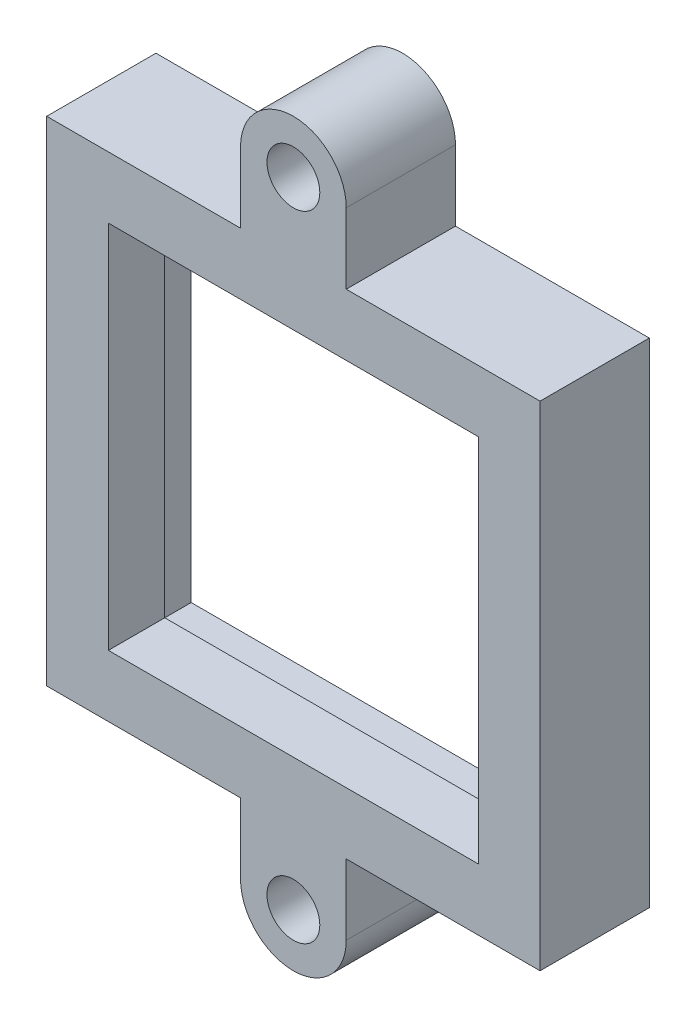
ISO-10303-21;
HEADER;
FILE_DESCRIPTION(('STEP AP214'),'2;1');
FILE_NAME('part.step','',(''),(''),'','','');
FILE_SCHEMA(('AUTOMOTIVE_DESIGN { 1 0 10303 214 1 1 1 1 }'));
ENDSEC;
DATA;
#1=APPLICATION_CONTEXT('core data for automotive mechanical design processes');
#2=APPLICATION_PROTOCOL_DEFINITION('international standard','automotive_design',2000,#1);
#3=PRODUCT_CONTEXT('',#1,'mechanical');
#4=PRODUCT('Part','Part','',(#3));
#5=PRODUCT_RELATED_PRODUCT_CATEGORY('part','',(#4));
#6=PRODUCT_DEFINITION_FORMATION('','',#4);
#7=PRODUCT_DEFINITION_CONTEXT('part definition',#1,'design');
#8=PRODUCT_DEFINITION('design','',#6,#7);
#9=PRODUCT_DEFINITION_SHAPE('','',#8);
#10=(LENGTH_UNIT() NAMED_UNIT(*) SI_UNIT(.MILLI.,.METRE.));
#11=(NAMED_UNIT(*) PLANE_ANGLE_UNIT() SI_UNIT($,.RADIAN.));
#12=(NAMED_UNIT(*) SI_UNIT($,.STERADIAN.) SOLID_ANGLE_UNIT());
#13=UNCERTAINTY_MEASURE_WITH_UNIT(LENGTH_MEASURE(1.E-05),#10,'distance_accuracy_value','');
#14=(GEOMETRIC_REPRESENTATION_CONTEXT(3) GLOBAL_UNCERTAINTY_ASSIGNED_CONTEXT((#13)) GLOBAL_UNIT_ASSIGNED_CONTEXT((#10,
#11,#12)) REPRESENTATION_CONTEXT('',''));
#15=CARTESIAN_POINT('',(0.,0.,0.));
#16=DIRECTION('',(0.,0.,1.));
#17=DIRECTION('',(1.,0.,0.));
#18=AXIS2_PLACEMENT_3D('',#15,#16,#17);
#19=CARTESIAN_POINT('',(-1.5,10.5,0.));
#20=DIRECTION('',(-1.,0.,0.));
#21=DIRECTION('',(0.,0.,1.));
#22=AXIS2_PLACEMENT_3D('',#19,#20,#21);
#23=PLANE('',#22);
#24=DIRECTION('',(0.,0.,-1.));
#25=VECTOR('',#24,1.);
#26=CARTESIAN_POINT('',(-1.5,7.,0.));
#27=LINE('',#26,#25);
#28=CARTESIAN_POINT('',(-1.5,7.,3.1));
#29=VERTEX_POINT('',#28);
#30=CARTESIAN_POINT('',(-1.5,7.,0.));
#31=VERTEX_POINT('',#30);
#32=EDGE_CURVE('E298',#29,#31,#27,.T.);
#33=ORIENTED_EDGE('',*,*,#32,.F.);
#34=DIRECTION('',(0.,-1.,0.));
#35=VECTOR('',#34,1.);
#36=CARTESIAN_POINT('',(-1.5,9.,3.1));
#37=LINE('',#36,#35);
#38=CARTESIAN_POINT('',(-1.5,9.,3.1));
#39=VERTEX_POINT('',#38);
#40=EDGE_CURVE('E276',#39,#29,#37,.T.);
#41=ORIENTED_EDGE('',*,*,#40,.F.);
#42=DIRECTION('',(0.,0.,1.));
#43=VECTOR('',#42,1.);
#44=CARTESIAN_POINT('',(-1.5,9.,-2.));
#45=LINE('',#44,#43);
#46=CARTESIAN_POINT('',(-1.5,9.,0.));
#47=VERTEX_POINT('',#46);
#48=EDGE_CURVE('E291',#47,#39,#45,.T.);
#49=ORIENTED_EDGE('',*,*,#48,.F.);
#50=DIRECTION('',(0.,-1.,0.));
#51=VECTOR('',#50,1.);
#52=CARTESIAN_POINT('',(-1.5,10.5,0.));
#53=LINE('',#52,#51);
#54=EDGE_CURVE('E86',#47,#31,#53,.T.);
#55=ORIENTED_EDGE('',*,*,#54,.T.);
#56=EDGE_LOOP('',(#33,#41,#49,#55));
#57=FACE_BOUND('',#56,.T.);
#58=ADVANCED_FACE('F71',(#57),#23,.T.);
#59=CARTESIAN_POINT('',(-7.,7.,1.5));
#60=DIRECTION('',(0.,-1.,0.));
#61=DIRECTION('',(1.,0.,0.));
#62=AXIS2_PLACEMENT_3D('',#59,#60,#61);
#63=PLANE('',#62);
#64=DIRECTION('',(-1.,0.,0.));
#65=VECTOR('',#64,1.);
#66=CARTESIAN_POINT('',(-7.,7.,0.));
#67=LINE('',#66,#65);
#68=CARTESIAN_POINT('',(7.,7.,0.));
#69=VERTEX_POINT('',#68);
#70=CARTESIAN_POINT('',(1.5,7.,0.));
#71=VERTEX_POINT('',#70);
#72=EDGE_CURVE('E361',#69,#71,#67,.T.);
#73=ORIENTED_EDGE('',*,*,#72,.T.);
#74=DIRECTION('',(0.,0.,1.));
#75=VECTOR('',#74,1.);
#76=CARTESIAN_POINT('',(1.5,7.,0.));
#77=LINE('',#76,#75);
#78=CARTESIAN_POINT('',(1.5,7.,3.1));
#79=VERTEX_POINT('',#78);
#80=EDGE_CURVE('E296',#71,#79,#77,.T.);
#81=ORIENTED_EDGE('',*,*,#80,.T.);
#82=DIRECTION('',(-1.,0.,0.));
#83=VECTOR('',#82,1.);
#84=CARTESIAN_POINT('',(7.,7.,3.1));
#85=LINE('',#84,#83);
#86=CARTESIAN_POINT('',(7.,7.,3.1));
#87=VERTEX_POINT('',#86);
#88=EDGE_CURVE('E267',#87,#79,#85,.T.);
#89=ORIENTED_EDGE('',*,*,#88,.F.);
#90=DIRECTION('',(0.,0.,-1.));
#91=VECTOR('',#90,1.);
#92=CARTESIAN_POINT('',(7.,7.,1.5));
#93=LINE('',#92,#91);
#94=EDGE_CURVE('E367',#87,#69,#93,.T.);
#95=ORIENTED_EDGE('',*,*,#94,.T.);
#96=EDGE_LOOP('',(#73,#81,#89,#95));
#97=FACE_BOUND('',#96,.T.);
#98=ADVANCED_FACE('F413',(#97),#63,.F.);
#99=CARTESIAN_POINT('',(0.,0.,0.));
#100=DIRECTION('',(0.,0.,-1.));
#101=DIRECTION('',(-1.,0.,0.));
#102=AXIS2_PLACEMENT_3D('',#99,#100,#101);
#103=PLANE('',#102);
#104=CARTESIAN_POINT('',(0.,9.,0.));
#105=DIRECTION('',(0.,0.,-1.));
#106=DIRECTION('',(-1.,0.,0.));
#107=AXIS2_PLACEMENT_3D('',#104,#105,#106);
#108=CIRCLE('',#107,1.5);
#109=CARTESIAN_POINT('',(1.5,9.,0.));
#110=VERTEX_POINT('',#109);
#111=EDGE_CURVE('E293',#110,#47,#108,.F.);
#112=ORIENTED_EDGE('',*,*,#111,.F.);
#113=DIRECTION('',(0.,-1.,0.));
#114=VECTOR('',#113,1.);
#115=CARTESIAN_POINT('',(1.5,10.5,0.));
#116=LINE('',#115,#114);
#117=EDGE_CURVE('E301',#110,#71,#116,.T.);
#118=ORIENTED_EDGE('',*,*,#117,.T.);
#119=ORIENTED_EDGE('',*,*,#72,.F.);
#120=DIRECTION('',(0.,1.,0.));
#121=VECTOR('',#120,1.);
#122=CARTESIAN_POINT('',(7.,-7.,0.));
#123=LINE('',#122,#121);
#124=CARTESIAN_POINT('',(7.,-7.,0.));
#125=VERTEX_POINT('',#124);
#126=EDGE_CURVE('E358',#125,#69,#123,.T.);
#127=ORIENTED_EDGE('',*,*,#126,.F.);
#128=DIRECTION('',(1.,0.,0.));
#129=VECTOR('',#128,1.);
#130=CARTESIAN_POINT('',(-7.,-7.,0.));
#131=LINE('',#130,#129);
#132=CARTESIAN_POINT('',(1.5,-7.,0.));
#133=VERTEX_POINT('',#132);
#134=EDGE_CURVE('E354',#133,#125,#131,.T.);
#135=ORIENTED_EDGE('',*,*,#134,.F.);
#136=DIRECTION('',(0.,1.,0.));
#137=VECTOR('',#136,1.);
#138=CARTESIAN_POINT('',(1.5,-10.5,0.));
#139=LINE('',#138,#137);
#140=CARTESIAN_POINT('',(1.5,-9.,0.));
#141=VERTEX_POINT('',#140);
#142=EDGE_CURVE('E94',#141,#133,#139,.T.);
#143=ORIENTED_EDGE('',*,*,#142,.F.);
#144=CARTESIAN_POINT('',(0.,-9.,0.));
#145=DIRECTION('',(0.,0.,-1.));
#146=DIRECTION('',(-1.,0.,0.));
#147=AXIS2_PLACEMENT_3D('',#144,#145,#146);
#148=CIRCLE('',#147,1.5);
#149=CARTESIAN_POINT('',(-1.5,-9.,0.));
#150=VERTEX_POINT('',#149);
#151=EDGE_CURVE('E305',#141,#150,#148,.T.);
#152=ORIENTED_EDGE('',*,*,#151,.T.);
#153=DIRECTION('',(0.,1.,0.));
#154=VECTOR('',#153,1.);
#155=CARTESIAN_POINT('',(-1.5,-10.5,0.));
#156=LINE('',#155,#154);
#157=CARTESIAN_POINT('',(-1.5,-7.,0.));
#158=VERTEX_POINT('',#157);
#159=EDGE_CURVE('E315',#150,#158,#156,.T.);
#160=ORIENTED_EDGE('',*,*,#159,.T.);
#161=CARTESIAN_POINT('',(-7.,-7.,0.));
#162=VERTEX_POINT('',#161);
#163=EDGE_CURVE('E355',#162,#158,#131,.T.);
#164=ORIENTED_EDGE('',*,*,#163,.F.);
#165=DIRECTION('',(0.,-1.,0.));
#166=VECTOR('',#165,1.);
#167=CARTESIAN_POINT('',(-7.,-7.,0.));
#168=LINE('',#167,#166);
#169=CARTESIAN_POINT('',(-7.,7.,0.));
#170=VERTEX_POINT('',#169);
#171=EDGE_CURVE('E351',#170,#162,#168,.T.);
#172=ORIENTED_EDGE('',*,*,#171,.F.);
#173=EDGE_CURVE('E360',#31,#170,#67,.T.);
#174=ORIENTED_EDGE('',*,*,#173,.F.);
#175=ORIENTED_EDGE('',*,*,#54,.F.);
#176=EDGE_LOOP('',(#112,#118,#119,#127,#135,#143,#152,#160,#164,#172,#174,#175));
#177=FACE_BOUND('',#176,.T.);
#178=CARTESIAN_POINT('',(0.,9.,0.));
#179=DIRECTION('',(0.,0.,-1.));
#180=DIRECTION('',(-1.,0.,0.));
#181=AXIS2_PLACEMENT_3D('',#178,#179,#180);
#182=CIRCLE('',#181,0.750000000000001);
#183=CARTESIAN_POINT('',(-0.75,9.,0.));
#184=VERTEX_POINT('',#183);
#185=EDGE_CURVE('E295',#184,#184,#182,.F.);
#186=ORIENTED_EDGE('',*,*,#185,.T.);
#187=EDGE_LOOP('',(#186));
#188=FACE_BOUND('',#187,.T.);
#189=CARTESIAN_POINT('',(0.,-9.,0.));
#190=DIRECTION('',(0.,0.,-1.));
#191=DIRECTION('',(-1.,0.,0.));
#192=AXIS2_PLACEMENT_3D('',#189,#190,#191);
#193=CIRCLE('',#192,0.750000000000001);
#194=CARTESIAN_POINT('',(-0.75,-9.,0.));
#195=VERTEX_POINT('',#194);
#196=EDGE_CURVE('E308',#195,#195,#193,.T.);
#197=ORIENTED_EDGE('',*,*,#196,.F.);
#198=EDGE_LOOP('',(#197));
#199=FACE_BOUND('',#198,.T.);
#200=DIRECTION('',(1.,0.,0.));
#201=VECTOR('',#200,1.);
#202=CARTESIAN_POINT('',(-6.,-6.,0.));
#203=LINE('',#202,#201);
#204=CARTESIAN_POINT('',(-6.,-6.,0.));
#205=VERTEX_POINT('',#204);
#206=CARTESIAN_POINT('',(6.,-6.,0.));
#207=VERTEX_POINT('',#206);
#208=EDGE_CURVE('E322',#205,#207,#203,.T.);
#209=ORIENTED_EDGE('',*,*,#208,.T.);
#210=DIRECTION('',(0.,1.,0.));
#211=VECTOR('',#210,1.);
#212=CARTESIAN_POINT('',(6.,-6.,0.));
#213=LINE('',#212,#211);
#214=CARTESIAN_POINT('',(6.,6.,0.));
#215=VERTEX_POINT('',#214);
#216=EDGE_CURVE('E317',#207,#215,#213,.T.);
#217=ORIENTED_EDGE('',*,*,#216,.T.);
#218=DIRECTION('',(-1.,0.,0.));
#219=VECTOR('',#218,1.);
#220=CARTESIAN_POINT('',(-6.,6.,0.));
#221=LINE('',#220,#219);
#222=CARTESIAN_POINT('',(-6.,6.,0.));
#223=VERTEX_POINT('',#222);
#224=EDGE_CURVE('E334',#215,#223,#221,.T.);
#225=ORIENTED_EDGE('',*,*,#224,.T.);
#226=DIRECTION('',(0.,-1.,0.));
#227=VECTOR('',#226,1.);
#228=CARTESIAN_POINT('',(-6.,-6.,0.));
#229=LINE('',#228,#227);
#230=EDGE_CURVE('E337',#223,#205,#229,.T.);
#231=ORIENTED_EDGE('',*,*,#230,.T.);
#232=EDGE_LOOP('',(#209,#217,#225,#231));
#233=FACE_BOUND('',#232,.T.);
#234=ADVANCED_FACE('F381',(#177,#188,#199,#233),#103,.T.);
#235=CARTESIAN_POINT('',(1.5,-10.5,0.));
#236=DIRECTION('',(-1.,0.,0.));
#237=DIRECTION('',(0.,0.,1.));
#238=AXIS2_PLACEMENT_3D('',#235,#236,#237);
#239=PLANE('',#238);
#240=DIRECTION('',(0.,0.,1.));
#241=VECTOR('',#240,1.);
#242=CARTESIAN_POINT('',(1.5,-9.,-2.));
#243=LINE('',#242,#241);
#244=CARTESIAN_POINT('',(1.5,-9.,3.1));
#245=VERTEX_POINT('',#244);
#246=EDGE_CURVE('E79',#141,#245,#243,.T.);
#247=ORIENTED_EDGE('',*,*,#246,.F.);
#248=ORIENTED_EDGE('',*,*,#142,.T.);
#249=DIRECTION('',(0.,0.,1.));
#250=VECTOR('',#249,1.);
#251=CARTESIAN_POINT('',(1.5,-7.,0.));
#252=LINE('',#251,#250);
#253=CARTESIAN_POINT('',(1.5,-7.,3.1));
#254=VERTEX_POINT('',#253);
#255=EDGE_CURVE('E309',#133,#254,#252,.T.);
#256=ORIENTED_EDGE('',*,*,#255,.T.);
#257=DIRECTION('',(0.,1.,0.));
#258=VECTOR('',#257,1.);
#259=CARTESIAN_POINT('',(1.5,-9.,3.1));
#260=LINE('',#259,#258);
#261=EDGE_CURVE('E258',#245,#254,#260,.T.);
#262=ORIENTED_EDGE('',*,*,#261,.F.);
#263=EDGE_LOOP('',(#247,#248,#256,#262));
#264=FACE_BOUND('',#263,.T.);
#265=ADVANCED_FACE('F437',(#264),#239,.F.);
#266=CARTESIAN_POINT('',(-7.,-7.,1.5));
#267=DIRECTION('',(0.,1.,0.));
#268=DIRECTION('',(0.,0.,1.));
#269=AXIS2_PLACEMENT_3D('',#266,#267,#268);
#270=PLANE('',#269);
#271=ORIENTED_EDGE('',*,*,#255,.F.);
#272=ORIENTED_EDGE('',*,*,#134,.T.);
#273=DIRECTION('',(0.,0.,-1.));
#274=VECTOR('',#273,1.);
#275=CARTESIAN_POINT('',(7.,-7.,1.5));
#276=LINE('',#275,#274);
#277=CARTESIAN_POINT('',(7.,-7.,3.1));
#278=VERTEX_POINT('',#277);
#279=EDGE_CURVE('E370',#278,#125,#276,.T.);
#280=ORIENTED_EDGE('',*,*,#279,.F.);
#281=DIRECTION('',(1.,0.,0.));
#282=VECTOR('',#281,1.);
#283=CARTESIAN_POINT('',(1.5,-7.,3.1));
#284=LINE('',#283,#282);
#285=EDGE_CURVE('E261',#254,#278,#284,.T.);
#286=ORIENTED_EDGE('',*,*,#285,.F.);
#287=EDGE_LOOP('',(#271,#272,#280,#286));
#288=FACE_BOUND('',#287,.T.);
#289=ADVANCED_FACE('F440',(#288),#270,.F.);
#290=DIRECTION('',(0.,0.,-1.));
#291=VECTOR('',#290,1.);
#292=CARTESIAN_POINT('',(-1.5,-7.,0.));
#293=LINE('',#292,#291);
#294=CARTESIAN_POINT('',(-1.5,-7.,3.1));
#295=VERTEX_POINT('',#294);
#296=EDGE_CURVE('E311',#295,#158,#293,.T.);
#297=ORIENTED_EDGE('',*,*,#296,.F.);
#298=DIRECTION('',(1.,0.,0.));
#299=VECTOR('',#298,1.);
#300=CARTESIAN_POINT('',(-7.,-7.,3.1));
#301=LINE('',#300,#299);
#302=CARTESIAN_POINT('',(-7.,-7.,3.1));
#303=VERTEX_POINT('',#302);
#304=EDGE_CURVE('E285',#303,#295,#301,.T.);
#305=ORIENTED_EDGE('',*,*,#304,.F.);
#306=DIRECTION('',(0.,0.,-1.));
#307=VECTOR('',#306,1.);
#308=CARTESIAN_POINT('',(-7.,-7.,1.5));
#309=LINE('',#308,#307);
#310=EDGE_CURVE('E373',#303,#162,#309,.T.);
#311=ORIENTED_EDGE('',*,*,#310,.T.);
#312=ORIENTED_EDGE('',*,*,#163,.T.);
#313=EDGE_LOOP('',(#297,#305,#311,#312));
#314=FACE_BOUND('',#313,.T.);
#315=ADVANCED_FACE('F465',(#314),#270,.F.);
#316=CARTESIAN_POINT('',(-7.,-7.,1.5));
#317=DIRECTION('',(1.,0.,0.));
#318=DIRECTION('',(0.,0.,-1.));
#319=AXIS2_PLACEMENT_3D('',#316,#317,#318);
#320=PLANE('',#319);
#321=ORIENTED_EDGE('',*,*,#171,.T.);
#322=ORIENTED_EDGE('',*,*,#310,.F.);
#323=DIRECTION('',(0.,-1.,0.));
#324=VECTOR('',#323,1.);
#325=CARTESIAN_POINT('',(-7.,7.,3.1));
#326=LINE('',#325,#324);
#327=CARTESIAN_POINT('',(-7.,7.,3.1));
#328=VERTEX_POINT('',#327);
#329=EDGE_CURVE('E282',#328,#303,#326,.T.);
#330=ORIENTED_EDGE('',*,*,#329,.F.);
#331=DIRECTION('',(0.,0.,-1.));
#332=VECTOR('',#331,1.);
#333=CARTESIAN_POINT('',(-7.,7.,1.5));
#334=LINE('',#333,#332);
#335=EDGE_CURVE('E364',#328,#170,#334,.T.);
#336=ORIENTED_EDGE('',*,*,#335,.T.);
#337=EDGE_LOOP('',(#321,#322,#330,#336));
#338=FACE_BOUND('',#337,.T.);
#339=ADVANCED_FACE('F73',(#338),#320,.F.);
#340=CARTESIAN_POINT('',(7.,-7.,1.5));
#341=DIRECTION('',(-1.,0.,0.));
#342=DIRECTION('',(0.,-1.,0.));
#343=AXIS2_PLACEMENT_3D('',#340,#341,#342);
#344=PLANE('',#343);
#345=ORIENTED_EDGE('',*,*,#126,.T.);
#346=ORIENTED_EDGE('',*,*,#94,.F.);
#347=DIRECTION('',(0.,1.,0.));
#348=VECTOR('',#347,1.);
#349=CARTESIAN_POINT('',(7.,-7.,3.1));
#350=LINE('',#349,#348);
#351=EDGE_CURVE('E264',#278,#87,#350,.T.);
#352=ORIENTED_EDGE('',*,*,#351,.F.);
#353=ORIENTED_EDGE('',*,*,#279,.T.);
#354=EDGE_LOOP('',(#345,#346,#352,#353));
#355=FACE_BOUND('',#354,.T.);
#356=ADVANCED_FACE('F460',(#355),#344,.F.);
#357=ORIENTED_EDGE('',*,*,#335,.F.);
#358=DIRECTION('',(-1.,0.,0.));
#359=VECTOR('',#358,1.);
#360=CARTESIAN_POINT('',(-1.5,7.,3.1));
#361=LINE('',#360,#359);
#362=EDGE_CURVE('E279',#29,#328,#361,.T.);
#363=ORIENTED_EDGE('',*,*,#362,.F.);
#364=ORIENTED_EDGE('',*,*,#32,.T.);
#365=ORIENTED_EDGE('',*,*,#173,.T.);
#366=EDGE_LOOP('',(#357,#363,#364,#365));
#367=FACE_BOUND('',#366,.T.);
#368=ADVANCED_FACE('F420',(#367),#63,.F.);
#369=CARTESIAN_POINT('',(6.,-6.,1.5));
#370=DIRECTION('',(-1.,0.,0.));
#371=DIRECTION('',(0.,0.,1.));
#372=AXIS2_PLACEMENT_3D('',#369,#370,#371);
#373=PLANE('',#372);
#374=ORIENTED_EDGE('',*,*,#216,.F.);
#375=DIRECTION('',(0.,0.,-1.));
#376=VECTOR('',#375,1.);
#377=CARTESIAN_POINT('',(6.,-6.,1.5));
#378=LINE('',#377,#376);
#379=CARTESIAN_POINT('',(6.,-6.,1.5));
#380=VERTEX_POINT('',#379);
#381=EDGE_CURVE('E331',#380,#207,#378,.T.);
#382=ORIENTED_EDGE('',*,*,#381,.F.);
#383=DIRECTION('',(0.,1.,0.));
#384=VECTOR('',#383,1.);
#385=CARTESIAN_POINT('',(6.,-6.,1.5));
#386=LINE('',#385,#384);
#387=CARTESIAN_POINT('',(6.,6.,1.5));
#388=VERTEX_POINT('',#387);
#389=EDGE_CURVE('E318',#380,#388,#386,.T.);
#390=ORIENTED_EDGE('',*,*,#389,.T.);
#391=DIRECTION('',(0.,0.,-1.));
#392=VECTOR('',#391,1.);
#393=CARTESIAN_POINT('',(6.,6.,1.5));
#394=LINE('',#393,#392);
#395=EDGE_CURVE('E348',#388,#215,#394,.T.);
#396=ORIENTED_EDGE('',*,*,#395,.T.);
#397=EDGE_LOOP('',(#374,#382,#390,#396));
#398=FACE_BOUND('',#397,.T.);
#399=ADVANCED_FACE('F451',(#398),#373,.T.);
#400=CARTESIAN_POINT('',(-6.,6.,1.5));
#401=DIRECTION('',(0.,-1.,0.));
#402=DIRECTION('',(0.,0.,-1.));
#403=AXIS2_PLACEMENT_3D('',#400,#401,#402);
#404=PLANE('',#403);
#405=ORIENTED_EDGE('',*,*,#224,.F.);
#406=ORIENTED_EDGE('',*,*,#395,.F.);
#407=DIRECTION('',(-1.,0.,0.));
#408=VECTOR('',#407,1.);
#409=CARTESIAN_POINT('',(-6.,6.,1.5));
#410=LINE('',#409,#408);
#411=CARTESIAN_POINT('',(-6.,6.,1.5));
#412=VERTEX_POINT('',#411);
#413=EDGE_CURVE('E321',#388,#412,#410,.T.);
#414=ORIENTED_EDGE('',*,*,#413,.T.);
#415=DIRECTION('',(0.,0.,-1.));
#416=VECTOR('',#415,1.);
#417=CARTESIAN_POINT('',(-6.,6.,1.5));
#418=LINE('',#417,#416);
#419=EDGE_CURVE('E346',#412,#223,#418,.T.);
#420=ORIENTED_EDGE('',*,*,#419,.T.);
#421=EDGE_LOOP('',(#405,#406,#414,#420));
#422=FACE_BOUND('',#421,.T.);
#423=ADVANCED_FACE('F447',(#422),#404,.T.);
#424=CARTESIAN_POINT('',(-6.,-6.,1.5));
#425=DIRECTION('',(1.,0.,0.));
#426=DIRECTION('',(0.,0.,-1.));
#427=AXIS2_PLACEMENT_3D('',#424,#425,#426);
#428=PLANE('',#427);
#429=ORIENTED_EDGE('',*,*,#230,.F.);
#430=ORIENTED_EDGE('',*,*,#419,.F.);
#431=DIRECTION('',(0.,-1.,0.));
#432=VECTOR('',#431,1.);
#433=CARTESIAN_POINT('',(-6.,-6.,1.5));
#434=LINE('',#433,#432);
#435=CARTESIAN_POINT('',(-6.,-6.,1.5));
#436=VERTEX_POINT('',#435);
#437=EDGE_CURVE('E325',#412,#436,#434,.T.);
#438=ORIENTED_EDGE('',*,*,#437,.T.);
#439=DIRECTION('',(0.,0.,-1.));
#440=VECTOR('',#439,1.);
#441=CARTESIAN_POINT('',(-6.,-6.,1.5));
#442=LINE('',#441,#440);
#443=EDGE_CURVE('E344',#436,#205,#442,.T.);
#444=ORIENTED_EDGE('',*,*,#443,.T.);
#445=EDGE_LOOP('',(#429,#430,#438,#444));
#446=FACE_BOUND('',#445,.T.);
#447=ADVANCED_FACE('F443',(#446),#428,.T.);
#448=CARTESIAN_POINT('',(-6.,-6.,1.5));
#449=DIRECTION('',(0.,1.,0.));
#450=DIRECTION('',(0.,0.,1.));
#451=AXIS2_PLACEMENT_3D('',#448,#449,#450);
#452=PLANE('',#451);
#453=ORIENTED_EDGE('',*,*,#208,.F.);
#454=ORIENTED_EDGE('',*,*,#443,.F.);
#455=DIRECTION('',(1.,0.,0.));
#456=VECTOR('',#455,1.);
#457=CARTESIAN_POINT('',(-6.,-6.,1.5));
#458=LINE('',#457,#456);
#459=EDGE_CURVE('E328',#436,#380,#458,.T.);
#460=ORIENTED_EDGE('',*,*,#459,.T.);
#461=ORIENTED_EDGE('',*,*,#381,.T.);
#462=EDGE_LOOP('',(#453,#454,#460,#461));
#463=FACE_BOUND('',#462,.T.);
#464=ADVANCED_FACE('F435',(#463),#452,.T.);
#465=CARTESIAN_POINT('',(-1.5,-10.5,0.));
#466=DIRECTION('',(1.,0.,0.));
#467=DIRECTION('',(0.,0.,-1.));
#468=AXIS2_PLACEMENT_3D('',#465,#466,#467);
#469=PLANE('',#468);
#470=ORIENTED_EDGE('',*,*,#159,.F.);
#471=DIRECTION('',(0.,0.,1.));
#472=VECTOR('',#471,1.);
#473=CARTESIAN_POINT('',(-1.5,-9.,-2.));
#474=LINE('',#473,#472);
#475=CARTESIAN_POINT('',(-1.5,-9.,3.1));
#476=VERTEX_POINT('',#475);
#477=EDGE_CURVE('E303',#150,#476,#474,.T.);
#478=ORIENTED_EDGE('',*,*,#477,.T.);
#479=DIRECTION('',(0.,-1.,0.));
#480=VECTOR('',#479,1.);
#481=CARTESIAN_POINT('',(-1.5,-9.,3.1));
#482=LINE('',#481,#480);
#483=EDGE_CURVE('E288',#295,#476,#482,.T.);
#484=ORIENTED_EDGE('',*,*,#483,.F.);
#485=ORIENTED_EDGE('',*,*,#296,.T.);
#486=EDGE_LOOP('',(#470,#478,#484,#485));
#487=FACE_BOUND('',#486,.T.);
#488=ADVANCED_FACE('F431',(#487),#469,.F.);
#489=CARTESIAN_POINT('',(0.,-9.,-2.));
#490=DIRECTION('',(0.,0.,1.));
#491=DIRECTION('',(1.,0.,0.));
#492=AXIS2_PLACEMENT_3D('',#489,#490,#491);
#493=CYLINDRICAL_SURFACE('',#492,0.750000000000001);
#494=ORIENTED_EDGE('',*,*,#196,.T.);
#495=EDGE_LOOP('',(#494));
#496=FACE_BOUND('',#495,.T.);
#497=CARTESIAN_POINT('',(0.,-9.,3.1));
#498=DIRECTION('',(0.,0.,1.));
#499=DIRECTION('',(1.,0.,0.));
#500=AXIS2_PLACEMENT_3D('',#497,#498,#499);
#501=CIRCLE('',#500,0.750000000000001);
#502=CARTESIAN_POINT('',(0.750000000000001,-9.,3.1));
#503=VERTEX_POINT('',#502);
#504=EDGE_CURVE('E393',#503,#503,#501,.T.);
#505=ORIENTED_EDGE('',*,*,#504,.T.);
#506=EDGE_LOOP('',(#505));
#507=FACE_BOUND('',#506,.T.);
#508=ADVANCED_FACE('F398',(#496,#507),#493,.F.);
#509=CARTESIAN_POINT('',(0.,-9.,-2.));
#510=DIRECTION('',(0.,0.,1.));
#511=DIRECTION('',(1.,0.,0.));
#512=AXIS2_PLACEMENT_3D('',#509,#510,#511);
#513=CYLINDRICAL_SURFACE('',#512,1.5);
#514=ORIENTED_EDGE('',*,*,#151,.F.);
#515=ORIENTED_EDGE('',*,*,#246,.T.);
#516=CARTESIAN_POINT('',(0.,-9.,3.1));
#517=DIRECTION('',(0.,0.,1.));
#518=DIRECTION('',(1.,0.,0.));
#519=AXIS2_PLACEMENT_3D('',#516,#517,#518);
#520=CIRCLE('',#519,1.5);
#521=EDGE_CURVE('E229',#476,#245,#520,.T.);
#522=ORIENTED_EDGE('',*,*,#521,.F.);
#523=ORIENTED_EDGE('',*,*,#477,.F.);
#524=EDGE_LOOP('',(#514,#515,#522,#523));
#525=FACE_BOUND('',#524,.T.);
#526=ADVANCED_FACE('F424',(#525),#513,.T.);
#527=CARTESIAN_POINT('',(1.5,10.5,0.));
#528=DIRECTION('',(1.,0.,0.));
#529=DIRECTION('',(0.,0.,-1.));
#530=AXIS2_PLACEMENT_3D('',#527,#528,#529);
#531=PLANE('',#530);
#532=DIRECTION('',(0.,0.,1.));
#533=VECTOR('',#532,1.);
#534=CARTESIAN_POINT('',(1.5,9.,-2.));
#535=LINE('',#534,#533);
#536=CARTESIAN_POINT('',(1.5,9.,3.1));
#537=VERTEX_POINT('',#536);
#538=EDGE_CURVE('E12',#537,#110,#535,.F.);
#539=ORIENTED_EDGE('',*,*,#538,.F.);
#540=DIRECTION('',(0.,1.,0.));
#541=VECTOR('',#540,1.);
#542=CARTESIAN_POINT('',(1.5,9.,3.1));
#543=LINE('',#542,#541);
#544=EDGE_CURVE('E270',#79,#537,#543,.T.);
#545=ORIENTED_EDGE('',*,*,#544,.F.);
#546=ORIENTED_EDGE('',*,*,#80,.F.);
#547=ORIENTED_EDGE('',*,*,#117,.F.);
#548=EDGE_LOOP('',(#539,#545,#546,#547));
#549=FACE_BOUND('',#548,.T.);
#550=ADVANCED_FACE('F388',(#549),#531,.T.);
#551=CARTESIAN_POINT('',(0.,9.,-2.));
#552=DIRECTION('',(0.,0.,1.));
#553=DIRECTION('',(1.,0.,0.));
#554=AXIS2_PLACEMENT_3D('',#551,#552,#553);
#555=CYLINDRICAL_SURFACE('',#554,0.750000000000001);
#556=ORIENTED_EDGE('',*,*,#185,.F.);
#557=EDGE_LOOP('',(#556));
#558=FACE_BOUND('',#557,.T.);
#559=CARTESIAN_POINT('',(0.,9.,3.1));
#560=DIRECTION('',(0.,0.,1.));
#561=DIRECTION('',(1.,0.,0.));
#562=AXIS2_PLACEMENT_3D('',#559,#560,#561);
#563=CIRCLE('',#562,0.750000000000001);
#564=CARTESIAN_POINT('',(0.750000000000001,9.,3.1));
#565=VERTEX_POINT('',#564);
#566=EDGE_CURVE('E245',#565,#565,#563,.T.);
#567=ORIENTED_EDGE('',*,*,#566,.T.);
#568=EDGE_LOOP('',(#567));
#569=FACE_BOUND('',#568,.T.);
#570=ADVANCED_FACE('F384',(#558,#569),#555,.F.);
#571=CARTESIAN_POINT('',(0.,9.,-2.));
#572=DIRECTION('',(0.,0.,1.));
#573=DIRECTION('',(1.,0.,0.));
#574=AXIS2_PLACEMENT_3D('',#571,#572,#573);
#575=CYLINDRICAL_SURFACE('',#574,1.5);
#576=ORIENTED_EDGE('',*,*,#111,.T.);
#577=ORIENTED_EDGE('',*,*,#48,.T.);
#578=CARTESIAN_POINT('',(0.,9.,3.1));
#579=DIRECTION('',(0.,0.,1.));
#580=DIRECTION('',(1.,0.,0.));
#581=AXIS2_PLACEMENT_3D('',#578,#579,#580);
#582=CIRCLE('',#581,1.5);
#583=EDGE_CURVE('E273',#537,#39,#582,.T.);
#584=ORIENTED_EDGE('',*,*,#583,.F.);
#585=ORIENTED_EDGE('',*,*,#538,.T.);
#586=EDGE_LOOP('',(#576,#577,#584,#585));
#587=FACE_BOUND('',#586,.T.);
#588=ADVANCED_FACE('F387',(#587),#575,.T.);
#589=CARTESIAN_POINT('',(0.,-9.,3.1));
#590=DIRECTION('',(0.,0.,1.));
#591=DIRECTION('',(1.,0.,0.));
#592=AXIS2_PLACEMENT_3D('',#589,#590,#591);
#593=PLANE('',#592);
#594=ORIENTED_EDGE('',*,*,#566,.F.);
#595=EDGE_LOOP('',(#594));
#596=FACE_BOUND('',#595,.T.);
#597=ORIENTED_EDGE('',*,*,#521,.T.);
#598=ORIENTED_EDGE('',*,*,#261,.T.);
#599=ORIENTED_EDGE('',*,*,#285,.T.);
#600=ORIENTED_EDGE('',*,*,#351,.T.);
#601=ORIENTED_EDGE('',*,*,#88,.T.);
#602=ORIENTED_EDGE('',*,*,#544,.T.);
#603=ORIENTED_EDGE('',*,*,#583,.T.);
#604=ORIENTED_EDGE('',*,*,#40,.T.);
#605=ORIENTED_EDGE('',*,*,#362,.T.);
#606=ORIENTED_EDGE('',*,*,#329,.T.);
#607=ORIENTED_EDGE('',*,*,#304,.T.);
#608=ORIENTED_EDGE('',*,*,#483,.T.);
#609=EDGE_LOOP('',(#597,#598,#599,#600,#601,#602,#603,#604,#605,#606,#607,#608));
#610=FACE_BOUND('',#609,.T.);
#611=DIRECTION('',(1.,0.,0.));
#612=VECTOR('',#611,1.);
#613=CARTESIAN_POINT('',(5.25,-5.25,3.1));
#614=LINE('',#613,#612);
#615=CARTESIAN_POINT('',(-5.25,-5.25,3.1));
#616=VERTEX_POINT('',#615);
#617=CARTESIAN_POINT('',(5.25,-5.25,3.1));
#618=VERTEX_POINT('',#617);
#619=EDGE_CURVE('E221',#616,#618,#614,.T.);
#620=ORIENTED_EDGE('',*,*,#619,.F.);
#621=DIRECTION('',(0.,-1.,0.));
#622=VECTOR('',#621,1.);
#623=CARTESIAN_POINT('',(-5.25,-5.25,3.1));
#624=LINE('',#623,#622);
#625=CARTESIAN_POINT('',(-5.25,5.25,3.1));
#626=VERTEX_POINT('',#625);
#627=EDGE_CURVE('E211',#626,#616,#624,.T.);
#628=ORIENTED_EDGE('',*,*,#627,.F.);
#629=DIRECTION('',(-1.,0.,0.));
#630=VECTOR('',#629,1.);
#631=CARTESIAN_POINT('',(5.25,5.25,3.1));
#632=LINE('',#631,#630);
#633=CARTESIAN_POINT('',(5.25,5.25,3.1));
#634=VERTEX_POINT('',#633);
#635=EDGE_CURVE('E238',#634,#626,#632,.T.);
#636=ORIENTED_EDGE('',*,*,#635,.F.);
#637=DIRECTION('',(0.,1.,0.));
#638=VECTOR('',#637,1.);
#639=CARTESIAN_POINT('',(5.25,-5.25,3.1));
#640=LINE('',#639,#638);
#641=EDGE_CURVE('E236',#618,#634,#640,.T.);
#642=ORIENTED_EDGE('',*,*,#641,.F.);
#643=EDGE_LOOP('',(#620,#628,#636,#642));
#644=FACE_BOUND('',#643,.T.);
#645=ORIENTED_EDGE('',*,*,#504,.F.);
#646=EDGE_LOOP('',(#645));
#647=FACE_BOUND('',#646,.T.);
#648=ADVANCED_FACE('F233',(#596,#610,#644,#647),#593,.T.);
#649=CARTESIAN_POINT('',(0.,-9.,1.5));
#650=DIRECTION('',(0.,0.,1.));
#651=DIRECTION('',(1.,0.,0.));
#652=AXIS2_PLACEMENT_3D('',#649,#650,#651);
#653=PLANE('',#652);
#654=ORIENTED_EDGE('',*,*,#389,.F.);
#655=ORIENTED_EDGE('',*,*,#459,.F.);
#656=ORIENTED_EDGE('',*,*,#437,.F.);
#657=ORIENTED_EDGE('',*,*,#413,.F.);
#658=EDGE_LOOP('',(#654,#655,#656,#657));
#659=FACE_BOUND('',#658,.T.);
#660=DIRECTION('',(0.,-1.,0.));
#661=VECTOR('',#660,1.);
#662=CARTESIAN_POINT('',(-5.25,-5.25,1.5));
#663=LINE('',#662,#661);
#664=CARTESIAN_POINT('',(-5.25,5.25,1.5));
#665=VERTEX_POINT('',#664);
#666=CARTESIAN_POINT('',(-5.25,-5.25,1.5));
#667=VERTEX_POINT('',#666);
#668=EDGE_CURVE('E243',#665,#667,#663,.T.);
#669=ORIENTED_EDGE('',*,*,#668,.T.);
#670=DIRECTION('',(1.,0.,0.));
#671=VECTOR('',#670,1.);
#672=CARTESIAN_POINT('',(5.25,-5.25,1.5));
#673=LINE('',#672,#671);
#674=CARTESIAN_POINT('',(5.25,-5.25,1.5));
#675=VERTEX_POINT('',#674);
#676=EDGE_CURVE('E228',#667,#675,#673,.T.);
#677=ORIENTED_EDGE('',*,*,#676,.T.);
#678=DIRECTION('',(0.,1.,0.));
#679=VECTOR('',#678,1.);
#680=CARTESIAN_POINT('',(5.25,-5.25,1.5));
#681=LINE('',#680,#679);
#682=CARTESIAN_POINT('',(5.25,5.25,1.5));
#683=VERTEX_POINT('',#682);
#684=EDGE_CURVE('E247',#675,#683,#681,.T.);
#685=ORIENTED_EDGE('',*,*,#684,.T.);
#686=DIRECTION('',(-1.,0.,0.));
#687=VECTOR('',#686,1.);
#688=CARTESIAN_POINT('',(5.25,5.25,1.5));
#689=LINE('',#688,#687);
#690=EDGE_CURVE('E222',#683,#665,#689,.T.);
#691=ORIENTED_EDGE('',*,*,#690,.T.);
#692=EDGE_LOOP('',(#669,#677,#685,#691));
#693=FACE_BOUND('',#692,.T.);
#694=ADVANCED_FACE('F400',(#659,#693),#653,.F.);
#695=CARTESIAN_POINT('',(-5.25,-5.25,3.1));
#696=DIRECTION('',(1.,0.,0.));
#697=DIRECTION('',(0.,0.,-1.));
#698=AXIS2_PLACEMENT_3D('',#695,#696,#697);
#699=PLANE('',#698);
#700=ORIENTED_EDGE('',*,*,#668,.F.);
#701=DIRECTION('',(0.,0.,-1.));
#702=VECTOR('',#701,1.);
#703=CARTESIAN_POINT('',(-5.25,5.25,3.1));
#704=LINE('',#703,#702);
#705=EDGE_CURVE('E217',#626,#665,#704,.T.);
#706=ORIENTED_EDGE('',*,*,#705,.F.);
#707=ORIENTED_EDGE('',*,*,#627,.T.);
#708=DIRECTION('',(0.,0.,-1.));
#709=VECTOR('',#708,1.);
#710=CARTESIAN_POINT('',(-5.25,-5.25,3.1));
#711=LINE('',#710,#709);
#712=EDGE_CURVE('E214',#616,#667,#711,.T.);
#713=ORIENTED_EDGE('',*,*,#712,.T.);
#714=EDGE_LOOP('',(#700,#706,#707,#713));
#715=FACE_BOUND('',#714,.T.);
#716=ADVANCED_FACE('F213',(#715),#699,.T.);
#717=CARTESIAN_POINT('',(5.25,-5.25,3.1));
#718=DIRECTION('',(0.,1.,0.));
#719=DIRECTION('',(-1.,0.,0.));
#720=AXIS2_PLACEMENT_3D('',#717,#718,#719);
#721=PLANE('',#720);
#722=ORIENTED_EDGE('',*,*,#676,.F.);
#723=ORIENTED_EDGE('',*,*,#712,.F.);
#724=ORIENTED_EDGE('',*,*,#619,.T.);
#725=DIRECTION('',(0.,0.,-1.));
#726=VECTOR('',#725,1.);
#727=CARTESIAN_POINT('',(5.25,-5.25,3.1));
#728=LINE('',#727,#726);
#729=EDGE_CURVE('E230',#618,#675,#728,.T.);
#730=ORIENTED_EDGE('',*,*,#729,.T.);
#731=EDGE_LOOP('',(#722,#723,#724,#730));
#732=FACE_BOUND('',#731,.T.);
#733=ADVANCED_FACE('F225',(#732),#721,.T.);
#734=CARTESIAN_POINT('',(5.25,-5.25,3.1));
#735=DIRECTION('',(-1.,0.,0.));
#736=DIRECTION('',(0.,0.,1.));
#737=AXIS2_PLACEMENT_3D('',#734,#735,#736);
#738=PLANE('',#737);
#739=ORIENTED_EDGE('',*,*,#684,.F.);
#740=ORIENTED_EDGE('',*,*,#729,.F.);
#741=ORIENTED_EDGE('',*,*,#641,.T.);
#742=DIRECTION('',(0.,0.,-1.));
#743=VECTOR('',#742,1.);
#744=CARTESIAN_POINT('',(5.25,5.25,3.1));
#745=LINE('',#744,#743);
#746=EDGE_CURVE('E253',#634,#683,#745,.T.);
#747=ORIENTED_EDGE('',*,*,#746,.T.);
#748=EDGE_LOOP('',(#739,#740,#741,#747));
#749=FACE_BOUND('',#748,.T.);
#750=ADVANCED_FACE('F572',(#749),#738,.T.);
#751=CARTESIAN_POINT('',(5.25,5.25,3.1));
#752=DIRECTION('',(0.,-1.,0.));
#753=DIRECTION('',(1.,0.,0.));
#754=AXIS2_PLACEMENT_3D('',#751,#752,#753);
#755=PLANE('',#754);
#756=ORIENTED_EDGE('',*,*,#690,.F.);
#757=ORIENTED_EDGE('',*,*,#746,.F.);
#758=ORIENTED_EDGE('',*,*,#635,.T.);
#759=ORIENTED_EDGE('',*,*,#705,.T.);
#760=EDGE_LOOP('',(#756,#757,#758,#759));
#761=FACE_BOUND('',#760,.T.);
#762=ADVANCED_FACE('F581',(#761),#755,.T.);
#763=CLOSED_SHELL('',(#58,#98,#234,#265,#289,#315,#339,#356,#368,#399,#423,#447,#464,#488,#508,
#526,#550,#570,#588,#648,#694,#716,#733,#750,#762));
#764=MANIFOLD_SOLID_BREP('B2',#763);
#765=ADVANCED_BREP_SHAPE_REPRESENTATION('',(#18,#764),#14);
#766=SHAPE_DEFINITION_REPRESENTATION(#9,#765);
ENDSEC;
END-ISO-10303-21;
